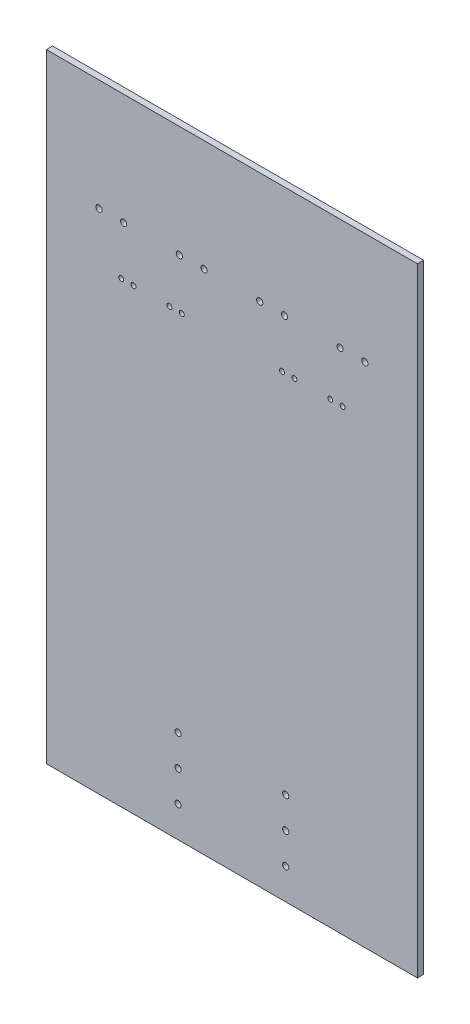
ISO-10303-21;
HEADER;
FILE_DESCRIPTION(('STEP AP214'),'2;1');
FILE_NAME('part.step','',(''),(''),'','','');
FILE_SCHEMA(('AUTOMOTIVE_DESIGN { 1 0 10303 214 1 1 1 1 }'));
ENDSEC;
DATA;
#1=APPLICATION_CONTEXT('core data for automotive mechanical design processes');
#2=APPLICATION_PROTOCOL_DEFINITION('international standard','automotive_design',2000,#1);
#3=PRODUCT_CONTEXT('',#1,'mechanical');
#4=PRODUCT('Part','Part','',(#3));
#5=PRODUCT_RELATED_PRODUCT_CATEGORY('part','',(#4));
#6=PRODUCT_DEFINITION_FORMATION('','',#4);
#7=PRODUCT_DEFINITION_CONTEXT('part definition',#1,'design');
#8=PRODUCT_DEFINITION('design','',#6,#7);
#9=PRODUCT_DEFINITION_SHAPE('','',#8);
#10=(LENGTH_UNIT() NAMED_UNIT(*) SI_UNIT(.MILLI.,.METRE.));
#11=(NAMED_UNIT(*) PLANE_ANGLE_UNIT() SI_UNIT($,.RADIAN.));
#12=(NAMED_UNIT(*) SI_UNIT($,.STERADIAN.) SOLID_ANGLE_UNIT());
#13=UNCERTAINTY_MEASURE_WITH_UNIT(LENGTH_MEASURE(1.E-05),#10,'distance_accuracy_value','');
#14=(GEOMETRIC_REPRESENTATION_CONTEXT(3) GLOBAL_UNCERTAINTY_ASSIGNED_CONTEXT((#13)) GLOBAL_UNIT_ASSIGNED_CONTEXT((#10,
#11,#12)) REPRESENTATION_CONTEXT('',''));
#15=CARTESIAN_POINT('',(0.,0.,0.));
#16=DIRECTION('',(0.,0.,1.));
#17=DIRECTION('',(1.,0.,0.));
#18=AXIS2_PLACEMENT_3D('',#15,#16,#17);
#19=CARTESIAN_POINT('',(0.,0.,5.));
#20=DIRECTION('',(1.,0.,0.));
#21=DIRECTION('',(0.,0.,-1.));
#22=AXIS2_PLACEMENT_3D('',#19,#20,#21);
#23=PLANE('',#22);
#24=DIRECTION('',(0.,-1.,0.));
#25=VECTOR('',#24,1.);
#26=CARTESIAN_POINT('',(0.,0.,0.));
#27=LINE('',#26,#25);
#28=CARTESIAN_POINT('',(0.,500.,0.));
#29=VERTEX_POINT('',#28);
#30=CARTESIAN_POINT('',(0.,0.,0.));
#31=VERTEX_POINT('',#30);
#32=EDGE_CURVE('E101',#29,#31,#27,.T.);
#33=ORIENTED_EDGE('',*,*,#32,.T.);
#34=DIRECTION('',(0.,0.,-1.));
#35=VECTOR('',#34,1.);
#36=CARTESIAN_POINT('',(0.,0.,5.));
#37=LINE('',#36,#35);
#38=CARTESIAN_POINT('',(0.,0.,5.));
#39=VERTEX_POINT('',#38);
#40=EDGE_CURVE('E11',#39,#31,#37,.T.);
#41=ORIENTED_EDGE('',*,*,#40,.F.);
#42=DIRECTION('',(0.,-1.,0.));
#43=VECTOR('',#42,1.);
#44=CARTESIAN_POINT('',(0.,0.,5.));
#45=LINE('',#44,#43);
#46=CARTESIAN_POINT('',(0.,500.,5.));
#47=VERTEX_POINT('',#46);
#48=EDGE_CURVE('E88',#47,#39,#45,.T.);
#49=ORIENTED_EDGE('',*,*,#48,.F.);
#50=DIRECTION('',(0.,0.,-1.));
#51=VECTOR('',#50,1.);
#52=CARTESIAN_POINT('',(0.,500.,5.));
#53=LINE('',#52,#51);
#54=EDGE_CURVE('E97',#47,#29,#53,.T.);
#55=ORIENTED_EDGE('',*,*,#54,.T.);
#56=EDGE_LOOP('',(#33,#41,#49,#55));
#57=FACE_BOUND('',#56,.T.);
#58=ADVANCED_FACE('F35',(#57),#23,.F.);
#59=CARTESIAN_POINT('',(0.,0.,5.));
#60=DIRECTION('',(0.,1.,0.));
#61=DIRECTION('',(0.,0.,1.));
#62=AXIS2_PLACEMENT_3D('',#59,#60,#61);
#63=PLANE('',#62);
#64=DIRECTION('',(1.,0.,0.));
#65=VECTOR('',#64,1.);
#66=CARTESIAN_POINT('',(0.,0.,0.));
#67=LINE('',#66,#65);
#68=CARTESIAN_POINT('',(300.,0.,0.));
#69=VERTEX_POINT('',#68);
#70=EDGE_CURVE('E92',#31,#69,#67,.T.);
#71=ORIENTED_EDGE('',*,*,#70,.T.);
#72=DIRECTION('',(0.,0.,-1.));
#73=VECTOR('',#72,1.);
#74=CARTESIAN_POINT('',(300.,0.,5.));
#75=LINE('',#74,#73);
#76=CARTESIAN_POINT('',(300.,0.,5.));
#77=VERTEX_POINT('',#76);
#78=EDGE_CURVE('E44',#77,#69,#75,.T.);
#79=ORIENTED_EDGE('',*,*,#78,.F.);
#80=DIRECTION('',(1.,0.,0.));
#81=VECTOR('',#80,1.);
#82=CARTESIAN_POINT('',(0.,0.,5.));
#83=LINE('',#82,#81);
#84=EDGE_CURVE('E83',#39,#77,#83,.T.);
#85=ORIENTED_EDGE('',*,*,#84,.F.);
#86=ORIENTED_EDGE('',*,*,#40,.T.);
#87=EDGE_LOOP('',(#71,#79,#85,#86));
#88=FACE_BOUND('',#87,.T.);
#89=ADVANCED_FACE('F91',(#88),#63,.F.);
#90=CARTESIAN_POINT('',(300.,0.,5.));
#91=DIRECTION('',(-1.,0.,0.));
#92=DIRECTION('',(0.,0.,1.));
#93=AXIS2_PLACEMENT_3D('',#90,#91,#92);
#94=PLANE('',#93);
#95=DIRECTION('',(0.,1.,0.));
#96=VECTOR('',#95,1.);
#97=CARTESIAN_POINT('',(300.,0.,0.));
#98=LINE('',#97,#96);
#99=CARTESIAN_POINT('',(300.,500.,0.));
#100=VERTEX_POINT('',#99);
#101=EDGE_CURVE('E70',#69,#100,#98,.T.);
#102=ORIENTED_EDGE('',*,*,#101,.T.);
#103=DIRECTION('',(0.,0.,-1.));
#104=VECTOR('',#103,1.);
#105=CARTESIAN_POINT('',(300.,500.,5.));
#106=LINE('',#105,#104);
#107=CARTESIAN_POINT('',(300.,500.,5.));
#108=VERTEX_POINT('',#107);
#109=EDGE_CURVE('E93',#108,#100,#106,.T.);
#110=ORIENTED_EDGE('',*,*,#109,.F.);
#111=DIRECTION('',(0.,1.,0.));
#112=VECTOR('',#111,1.);
#113=CARTESIAN_POINT('',(300.,0.,5.));
#114=LINE('',#113,#112);
#115=EDGE_CURVE('E86',#77,#108,#114,.T.);
#116=ORIENTED_EDGE('',*,*,#115,.F.);
#117=ORIENTED_EDGE('',*,*,#78,.T.);
#118=EDGE_LOOP('',(#102,#110,#116,#117));
#119=FACE_BOUND('',#118,.T.);
#120=ADVANCED_FACE('F95',(#119),#94,.F.);
#121=CARTESIAN_POINT('',(0.,500.,5.));
#122=DIRECTION('',(0.,-1.,0.));
#123=DIRECTION('',(0.,0.,-1.));
#124=AXIS2_PLACEMENT_3D('',#121,#122,#123);
#125=PLANE('',#124);
#126=DIRECTION('',(-1.,0.,0.));
#127=VECTOR('',#126,1.);
#128=CARTESIAN_POINT('',(0.,500.,0.));
#129=LINE('',#128,#127);
#130=EDGE_CURVE('E76',#100,#29,#129,.T.);
#131=ORIENTED_EDGE('',*,*,#130,.T.);
#132=ORIENTED_EDGE('',*,*,#54,.F.);
#133=DIRECTION('',(-1.,0.,0.));
#134=VECTOR('',#133,1.);
#135=CARTESIAN_POINT('',(0.,500.,5.));
#136=LINE('',#135,#134);
#137=EDGE_CURVE('E53',#108,#47,#136,.T.);
#138=ORIENTED_EDGE('',*,*,#137,.F.);
#139=ORIENTED_EDGE('',*,*,#109,.T.);
#140=EDGE_LOOP('',(#131,#132,#138,#139));
#141=FACE_BOUND('',#140,.T.);
#142=ADVANCED_FACE('F230',(#141),#125,.F.);
#143=CARTESIAN_POINT('',(0.,0.,5.));
#144=DIRECTION('',(0.,0.,-1.));
#145=DIRECTION('',(-1.,0.,0.));
#146=AXIS2_PLACEMENT_3D('',#143,#144,#145);
#147=PLANE('',#146);
#148=CARTESIAN_POINT('',(106.5,50.,5.));
#149=DIRECTION('',(0.,0.,1.));
#150=DIRECTION('',(1.,0.,0.));
#151=AXIS2_PLACEMENT_3D('',#148,#149,#150);
#152=CIRCLE('',#151,2.50000000000001);
#153=CARTESIAN_POINT('',(109.,50.,5.));
#154=VERTEX_POINT('',#153);
#155=EDGE_CURVE('E383',#154,#154,#152,.T.);
#156=ORIENTED_EDGE('',*,*,#155,.F.);
#157=EDGE_LOOP('',(#156));
#158=FACE_BOUND('',#157,.T.);
#159=CARTESIAN_POINT('',(106.5,75.,5.));
#160=DIRECTION('',(0.,0.,1.));
#161=DIRECTION('',(1.,0.,0.));
#162=AXIS2_PLACEMENT_3D('',#159,#160,#161);
#163=CIRCLE('',#162,2.50000000000001);
#164=CARTESIAN_POINT('',(109.,75.,5.));
#165=VERTEX_POINT('',#164);
#166=EDGE_CURVE('E386',#165,#165,#163,.T.);
#167=ORIENTED_EDGE('',*,*,#166,.F.);
#168=EDGE_LOOP('',(#167));
#169=FACE_BOUND('',#168,.T.);
#170=CARTESIAN_POINT('',(193.5,25.,5.));
#171=DIRECTION('',(0.,0.,1.));
#172=DIRECTION('',(1.,0.,0.));
#173=AXIS2_PLACEMENT_3D('',#170,#171,#172);
#174=CIRCLE('',#173,2.5);
#175=CARTESIAN_POINT('',(196.,25.,5.));
#176=VERTEX_POINT('',#175);
#177=EDGE_CURVE('E380',#176,#176,#174,.T.);
#178=ORIENTED_EDGE('',*,*,#177,.F.);
#179=EDGE_LOOP('',(#178));
#180=FACE_BOUND('',#179,.T.);
#181=CARTESIAN_POINT('',(193.5,50.,5.));
#182=DIRECTION('',(0.,0.,1.));
#183=DIRECTION('',(1.,0.,0.));
#184=AXIS2_PLACEMENT_3D('',#181,#182,#183);
#185=CIRCLE('',#184,2.5);
#186=CARTESIAN_POINT('',(196.,50.,5.));
#187=VERTEX_POINT('',#186);
#188=EDGE_CURVE('E377',#187,#187,#185,.T.);
#189=ORIENTED_EDGE('',*,*,#188,.F.);
#190=EDGE_LOOP('',(#189));
#191=FACE_BOUND('',#190,.T.);
#192=CARTESIAN_POINT('',(193.5,75.,5.));
#193=DIRECTION('',(0.,0.,1.));
#194=DIRECTION('',(1.,0.,0.));
#195=AXIS2_PLACEMENT_3D('',#192,#193,#194);
#196=CIRCLE('',#195,2.5);
#197=CARTESIAN_POINT('',(196.,75.,5.));
#198=VERTEX_POINT('',#197);
#199=EDGE_CURVE('E375',#198,#198,#196,.T.);
#200=ORIENTED_EDGE('',*,*,#199,.F.);
#201=EDGE_LOOP('',(#200));
#202=FACE_BOUND('',#201,.T.);
#203=CARTESIAN_POINT('',(106.5,25.,5.));
#204=DIRECTION('',(0.,0.,1.));
#205=DIRECTION('',(1.,0.,0.));
#206=AXIS2_PLACEMENT_3D('',#203,#204,#205);
#207=CIRCLE('',#206,2.50000000000001);
#208=CARTESIAN_POINT('',(109.,25.,5.));
#209=VERTEX_POINT('',#208);
#210=EDGE_CURVE('E162',#209,#209,#207,.T.);
#211=ORIENTED_EDGE('',*,*,#210,.F.);
#212=EDGE_LOOP('',(#211));
#213=FACE_BOUND('',#212,.T.);
#214=CARTESIAN_POINT('',(42.5,410.,5.));
#215=DIRECTION('',(0.,0.,1.));
#216=DIRECTION('',(1.,0.,0.));
#217=AXIS2_PLACEMENT_3D('',#214,#215,#216);
#218=CIRCLE('',#217,2.5);
#219=CARTESIAN_POINT('',(45.,410.,5.));
#220=VERTEX_POINT('',#219);
#221=EDGE_CURVE('E114',#220,#220,#218,.T.);
#222=ORIENTED_EDGE('',*,*,#221,.F.);
#223=EDGE_LOOP('',(#222));
#224=FACE_BOUND('',#223,.T.);
#225=CARTESIAN_POINT('',(60.5,370.,5.));
#226=DIRECTION('',(0.,0.,1.));
#227=DIRECTION('',(1.,0.,0.));
#228=AXIS2_PLACEMENT_3D('',#225,#226,#227);
#229=CIRCLE('',#228,2.);
#230=CARTESIAN_POINT('',(62.5,370.,5.));
#231=VERTEX_POINT('',#230);
#232=EDGE_CURVE('E192',#231,#231,#229,.T.);
#233=ORIENTED_EDGE('',*,*,#232,.F.);
#234=EDGE_LOOP('',(#233));
#235=FACE_BOUND('',#234,.T.);
#236=CARTESIAN_POINT('',(229.5,370.,5.));
#237=DIRECTION('',(0.,0.,1.));
#238=DIRECTION('',(1.,0.,0.));
#239=AXIS2_PLACEMENT_3D('',#236,#237,#238);
#240=CIRCLE('',#239,2.);
#241=CARTESIAN_POINT('',(231.5,370.,5.));
#242=VERTEX_POINT('',#241);
#243=EDGE_CURVE('E188',#242,#242,#240,.T.);
#244=ORIENTED_EDGE('',*,*,#243,.F.);
#245=EDGE_LOOP('',(#244));
#246=FACE_BOUND('',#245,.T.);
#247=CARTESIAN_POINT('',(200.5,370.,5.));
#248=DIRECTION('',(0.,0.,1.));
#249=DIRECTION('',(1.,0.,0.));
#250=AXIS2_PLACEMENT_3D('',#247,#248,#249);
#251=CIRCLE('',#250,2.);
#252=CARTESIAN_POINT('',(202.5,370.,5.));
#253=VERTEX_POINT('',#252);
#254=EDGE_CURVE('E191',#253,#253,#251,.T.);
#255=ORIENTED_EDGE('',*,*,#254,.F.);
#256=EDGE_LOOP('',(#255));
#257=FACE_BOUND('',#256,.T.);
#258=CARTESIAN_POINT('',(257.5,410.,5.));
#259=DIRECTION('',(0.,0.,1.));
#260=DIRECTION('',(1.,0.,0.));
#261=AXIS2_PLACEMENT_3D('',#258,#259,#260);
#262=CIRCLE('',#261,2.50000000000002);
#263=CARTESIAN_POINT('',(260.,410.,5.));
#264=VERTEX_POINT('',#263);
#265=EDGE_CURVE('E195',#264,#264,#262,.T.);
#266=ORIENTED_EDGE('',*,*,#265,.F.);
#267=EDGE_LOOP('',(#266));
#268=FACE_BOUND('',#267,.T.);
#269=CARTESIAN_POINT('',(109.5,370.,5.));
#270=DIRECTION('',(0.,0.,1.));
#271=DIRECTION('',(1.,0.,0.));
#272=AXIS2_PLACEMENT_3D('',#269,#270,#271);
#273=CIRCLE('',#272,2.);
#274=CARTESIAN_POINT('',(111.5,370.,5.));
#275=VERTEX_POINT('',#274);
#276=EDGE_CURVE('E184',#275,#275,#273,.T.);
#277=ORIENTED_EDGE('',*,*,#276,.F.);
#278=EDGE_LOOP('',(#277));
#279=FACE_BOUND('',#278,.T.);
#280=CARTESIAN_POINT('',(190.5,370.,5.));
#281=DIRECTION('',(0.,0.,1.));
#282=DIRECTION('',(1.,0.,0.));
#283=AXIS2_PLACEMENT_3D('',#280,#281,#282);
#284=CIRCLE('',#283,2.);
#285=CARTESIAN_POINT('',(192.5,370.,5.));
#286=VERTEX_POINT('',#285);
#287=EDGE_CURVE('E179',#286,#286,#284,.T.);
#288=ORIENTED_EDGE('',*,*,#287,.F.);
#289=EDGE_LOOP('',(#288));
#290=FACE_BOUND('',#289,.T.);
#291=CARTESIAN_POINT('',(239.5,370.,5.));
#292=DIRECTION('',(0.,0.,1.));
#293=DIRECTION('',(1.,0.,0.));
#294=AXIS2_PLACEMENT_3D('',#291,#292,#293);
#295=CIRCLE('',#294,2.);
#296=CARTESIAN_POINT('',(241.5,370.,5.));
#297=VERTEX_POINT('',#296);
#298=EDGE_CURVE('E175',#297,#297,#295,.T.);
#299=ORIENTED_EDGE('',*,*,#298,.F.);
#300=EDGE_LOOP('',(#299));
#301=FACE_BOUND('',#300,.T.);
#302=CARTESIAN_POINT('',(70.5,370.,5.));
#303=DIRECTION('',(0.,0.,1.));
#304=DIRECTION('',(1.,0.,0.));
#305=AXIS2_PLACEMENT_3D('',#302,#303,#304);
#306=CIRCLE('',#305,2.);
#307=CARTESIAN_POINT('',(72.5,370.,5.));
#308=VERTEX_POINT('',#307);
#309=EDGE_CURVE('E204',#308,#308,#306,.T.);
#310=ORIENTED_EDGE('',*,*,#309,.F.);
#311=EDGE_LOOP('',(#310));
#312=FACE_BOUND('',#311,.T.);
#313=CARTESIAN_POINT('',(127.5,410.000000000001,5.));
#314=DIRECTION('',(0.,0.,1.));
#315=DIRECTION('',(1.,0.,0.));
#316=AXIS2_PLACEMENT_3D('',#313,#314,#315);
#317=CIRCLE('',#316,2.5);
#318=CARTESIAN_POINT('',(130.,410.000000000001,5.));
#319=VERTEX_POINT('',#318);
#320=EDGE_CURVE('E213',#319,#319,#317,.T.);
#321=ORIENTED_EDGE('',*,*,#320,.F.);
#322=EDGE_LOOP('',(#321));
#323=FACE_BOUND('',#322,.T.);
#324=CARTESIAN_POINT('',(107.5,410.,5.));
#325=DIRECTION('',(0.,0.,1.));
#326=DIRECTION('',(1.,0.,0.));
#327=AXIS2_PLACEMENT_3D('',#324,#325,#326);
#328=CIRCLE('',#327,2.5);
#329=CARTESIAN_POINT('',(110.,410.,5.));
#330=VERTEX_POINT('',#329);
#331=EDGE_CURVE('E216',#330,#330,#328,.T.);
#332=ORIENTED_EDGE('',*,*,#331,.F.);
#333=EDGE_LOOP('',(#332));
#334=FACE_BOUND('',#333,.T.);
#335=CARTESIAN_POINT('',(62.5,410.,5.));
#336=DIRECTION('',(0.,0.,1.));
#337=DIRECTION('',(1.,0.,0.));
#338=AXIS2_PLACEMENT_3D('',#335,#336,#337);
#339=CIRCLE('',#338,2.50000000000001);
#340=CARTESIAN_POINT('',(65.,410.,5.));
#341=VERTEX_POINT('',#340);
#342=EDGE_CURVE('E219',#341,#341,#339,.T.);
#343=ORIENTED_EDGE('',*,*,#342,.F.);
#344=EDGE_LOOP('',(#343));
#345=FACE_BOUND('',#344,.T.);
#346=CARTESIAN_POINT('',(99.5,370.,5.));
#347=DIRECTION('',(0.,0.,1.));
#348=DIRECTION('',(1.,0.,0.));
#349=AXIS2_PLACEMENT_3D('',#346,#347,#348);
#350=CIRCLE('',#349,2.);
#351=CARTESIAN_POINT('',(101.5,370.,5.));
#352=VERTEX_POINT('',#351);
#353=EDGE_CURVE('E201',#352,#352,#350,.T.);
#354=ORIENTED_EDGE('',*,*,#353,.F.);
#355=EDGE_LOOP('',(#354));
#356=FACE_BOUND('',#355,.T.);
#357=CARTESIAN_POINT('',(172.5,410.,5.));
#358=DIRECTION('',(0.,0.,1.));
#359=DIRECTION('',(1.,0.,0.));
#360=AXIS2_PLACEMENT_3D('',#357,#358,#359);
#361=CIRCLE('',#360,2.5);
#362=CARTESIAN_POINT('',(175.,410.,5.));
#363=VERTEX_POINT('',#362);
#364=EDGE_CURVE('E205',#363,#363,#361,.T.);
#365=ORIENTED_EDGE('',*,*,#364,.F.);
#366=EDGE_LOOP('',(#365));
#367=FACE_BOUND('',#366,.T.);
#368=CARTESIAN_POINT('',(192.5,410.,5.));
#369=DIRECTION('',(0.,0.,1.));
#370=DIRECTION('',(1.,0.,0.));
#371=AXIS2_PLACEMENT_3D('',#368,#369,#370);
#372=CIRCLE('',#371,2.5);
#373=CARTESIAN_POINT('',(195.,410.,5.));
#374=VERTEX_POINT('',#373);
#375=EDGE_CURVE('E208',#374,#374,#372,.T.);
#376=ORIENTED_EDGE('',*,*,#375,.F.);
#377=EDGE_LOOP('',(#376));
#378=FACE_BOUND('',#377,.T.);
#379=CARTESIAN_POINT('',(237.5,410.,5.));
#380=DIRECTION('',(0.,0.,1.));
#381=DIRECTION('',(1.,0.,0.));
#382=AXIS2_PLACEMENT_3D('',#379,#380,#381);
#383=CIRCLE('',#382,2.50000000000002);
#384=CARTESIAN_POINT('',(240.,410.,5.));
#385=VERTEX_POINT('',#384);
#386=EDGE_CURVE('E198',#385,#385,#383,.T.);
#387=ORIENTED_EDGE('',*,*,#386,.F.);
#388=EDGE_LOOP('',(#387));
#389=FACE_BOUND('',#388,.T.);
#390=ORIENTED_EDGE('',*,*,#48,.T.);
#391=ORIENTED_EDGE('',*,*,#84,.T.);
#392=ORIENTED_EDGE('',*,*,#115,.T.);
#393=ORIENTED_EDGE('',*,*,#137,.T.);
#394=EDGE_LOOP('',(#390,#391,#392,#393));
#395=FACE_BOUND('',#394,.T.);
#396=ADVANCED_FACE('F84',(#158,#169,#180,#191,#202,#213,#224,#235,#246,#257,#268,#279,#290,#301,
#312,#323,#334,#345,#356,#367,#378,#389,#395),#147,.F.);
#397=CARTESIAN_POINT('',(0.,0.,0.));
#398=DIRECTION('',(0.,0.,-1.));
#399=DIRECTION('',(-1.,0.,0.));
#400=AXIS2_PLACEMENT_3D('',#397,#398,#399);
#401=PLANE('',#400);
#402=CARTESIAN_POINT('',(106.5,50.,0.));
#403=DIRECTION('',(0.,0.,-1.));
#404=DIRECTION('',(-1.,0.,0.));
#405=AXIS2_PLACEMENT_3D('',#402,#403,#404);
#406=CIRCLE('',#405,2.50000000000001);
#407=CARTESIAN_POINT('',(104.,50.,0.));
#408=VERTEX_POINT('',#407);
#409=EDGE_CURVE('E38',#408,#408,#406,.T.);
#410=ORIENTED_EDGE('',*,*,#409,.F.);
#411=EDGE_LOOP('',(#410));
#412=FACE_BOUND('',#411,.T.);
#413=CARTESIAN_POINT('',(106.5,75.,0.));
#414=DIRECTION('',(0.,0.,-1.));
#415=DIRECTION('',(-1.,0.,0.));
#416=AXIS2_PLACEMENT_3D('',#413,#414,#415);
#417=CIRCLE('',#416,2.50000000000001);
#418=CARTESIAN_POINT('',(104.,75.,0.));
#419=VERTEX_POINT('',#418);
#420=EDGE_CURVE('E170',#419,#419,#417,.T.);
#421=ORIENTED_EDGE('',*,*,#420,.F.);
#422=EDGE_LOOP('',(#421));
#423=FACE_BOUND('',#422,.T.);
#424=CARTESIAN_POINT('',(193.5,25.,0.));
#425=DIRECTION('',(0.,0.,-1.));
#426=DIRECTION('',(-1.,0.,0.));
#427=AXIS2_PLACEMENT_3D('',#424,#425,#426);
#428=CIRCLE('',#427,2.5);
#429=CARTESIAN_POINT('',(191.,25.,0.));
#430=VERTEX_POINT('',#429);
#431=EDGE_CURVE('E168',#430,#430,#428,.T.);
#432=ORIENTED_EDGE('',*,*,#431,.F.);
#433=EDGE_LOOP('',(#432));
#434=FACE_BOUND('',#433,.T.);
#435=CARTESIAN_POINT('',(193.5,50.,0.));
#436=DIRECTION('',(0.,0.,-1.));
#437=DIRECTION('',(-1.,0.,0.));
#438=AXIS2_PLACEMENT_3D('',#435,#436,#437);
#439=CIRCLE('',#438,2.5);
#440=CARTESIAN_POINT('',(191.,50.,0.));
#441=VERTEX_POINT('',#440);
#442=EDGE_CURVE('E165',#441,#441,#439,.T.);
#443=ORIENTED_EDGE('',*,*,#442,.F.);
#444=EDGE_LOOP('',(#443));
#445=FACE_BOUND('',#444,.T.);
#446=CARTESIAN_POINT('',(193.5,75.,0.));
#447=DIRECTION('',(0.,0.,-1.));
#448=DIRECTION('',(-1.,0.,0.));
#449=AXIS2_PLACEMENT_3D('',#446,#447,#448);
#450=CIRCLE('',#449,2.5);
#451=CARTESIAN_POINT('',(191.,75.,0.));
#452=VERTEX_POINT('',#451);
#453=EDGE_CURVE('E161',#452,#452,#450,.T.);
#454=ORIENTED_EDGE('',*,*,#453,.F.);
#455=EDGE_LOOP('',(#454));
#456=FACE_BOUND('',#455,.T.);
#457=CARTESIAN_POINT('',(106.5,25.,0.));
#458=DIRECTION('',(0.,0.,-1.));
#459=DIRECTION('',(-1.,0.,0.));
#460=AXIS2_PLACEMENT_3D('',#457,#458,#459);
#461=CIRCLE('',#460,2.50000000000001);
#462=CARTESIAN_POINT('',(104.,25.,0.));
#463=VERTEX_POINT('',#462);
#464=EDGE_CURVE('E158',#463,#463,#461,.T.);
#465=ORIENTED_EDGE('',*,*,#464,.F.);
#466=EDGE_LOOP('',(#465));
#467=FACE_BOUND('',#466,.T.);
#468=CARTESIAN_POINT('',(42.5,410.,0.));
#469=DIRECTION('',(0.,0.,-1.));
#470=DIRECTION('',(-1.,0.,0.));
#471=AXIS2_PLACEMENT_3D('',#468,#469,#470);
#472=CIRCLE('',#471,2.5);
#473=CARTESIAN_POINT('',(40.,410.,0.));
#474=VERTEX_POINT('',#473);
#475=EDGE_CURVE('E104',#474,#474,#472,.T.);
#476=ORIENTED_EDGE('',*,*,#475,.F.);
#477=EDGE_LOOP('',(#476));
#478=FACE_BOUND('',#477,.T.);
#479=CARTESIAN_POINT('',(60.5,370.,0.));
#480=DIRECTION('',(0.,0.,-1.));
#481=DIRECTION('',(-1.,0.,0.));
#482=AXIS2_PLACEMENT_3D('',#479,#480,#481);
#483=CIRCLE('',#482,2.);
#484=CARTESIAN_POINT('',(58.5,370.,0.));
#485=VERTEX_POINT('',#484);
#486=EDGE_CURVE('E153',#485,#485,#483,.T.);
#487=ORIENTED_EDGE('',*,*,#486,.F.);
#488=EDGE_LOOP('',(#487));
#489=FACE_BOUND('',#488,.T.);
#490=CARTESIAN_POINT('',(229.5,370.,0.));
#491=DIRECTION('',(0.,0.,-1.));
#492=DIRECTION('',(-1.,0.,0.));
#493=AXIS2_PLACEMENT_3D('',#490,#491,#492);
#494=CIRCLE('',#493,2.);
#495=CARTESIAN_POINT('',(227.5,370.,0.));
#496=VERTEX_POINT('',#495);
#497=EDGE_CURVE('E150',#496,#496,#494,.T.);
#498=ORIENTED_EDGE('',*,*,#497,.F.);
#499=EDGE_LOOP('',(#498));
#500=FACE_BOUND('',#499,.T.);
#501=CARTESIAN_POINT('',(200.5,370.,0.));
#502=DIRECTION('',(0.,0.,-1.));
#503=DIRECTION('',(-1.,0.,0.));
#504=AXIS2_PLACEMENT_3D('',#501,#502,#503);
#505=CIRCLE('',#504,2.);
#506=CARTESIAN_POINT('',(198.5,370.,0.));
#507=VERTEX_POINT('',#506);
#508=EDGE_CURVE('E147',#507,#507,#505,.T.);
#509=ORIENTED_EDGE('',*,*,#508,.F.);
#510=EDGE_LOOP('',(#509));
#511=FACE_BOUND('',#510,.T.);
#512=CARTESIAN_POINT('',(257.5,410.,0.));
#513=DIRECTION('',(0.,0.,-1.));
#514=DIRECTION('',(-1.,0.,0.));
#515=AXIS2_PLACEMENT_3D('',#512,#513,#514);
#516=CIRCLE('',#515,2.50000000000002);
#517=CARTESIAN_POINT('',(255.,410.,0.));
#518=VERTEX_POINT('',#517);
#519=EDGE_CURVE('E144',#518,#518,#516,.T.);
#520=ORIENTED_EDGE('',*,*,#519,.F.);
#521=EDGE_LOOP('',(#520));
#522=FACE_BOUND('',#521,.T.);
#523=CARTESIAN_POINT('',(109.5,370.,0.));
#524=DIRECTION('',(0.,0.,-1.));
#525=DIRECTION('',(-1.,0.,0.));
#526=AXIS2_PLACEMENT_3D('',#523,#524,#525);
#527=CIRCLE('',#526,2.);
#528=CARTESIAN_POINT('',(107.5,370.,0.));
#529=VERTEX_POINT('',#528);
#530=EDGE_CURVE('E141',#529,#529,#527,.T.);
#531=ORIENTED_EDGE('',*,*,#530,.F.);
#532=EDGE_LOOP('',(#531));
#533=FACE_BOUND('',#532,.T.);
#534=CARTESIAN_POINT('',(190.5,370.,0.));
#535=DIRECTION('',(0.,0.,-1.));
#536=DIRECTION('',(-1.,0.,0.));
#537=AXIS2_PLACEMENT_3D('',#534,#535,#536);
#538=CIRCLE('',#537,2.);
#539=CARTESIAN_POINT('',(188.5,370.,0.));
#540=VERTEX_POINT('',#539);
#541=EDGE_CURVE('E138',#540,#540,#538,.T.);
#542=ORIENTED_EDGE('',*,*,#541,.F.);
#543=EDGE_LOOP('',(#542));
#544=FACE_BOUND('',#543,.T.);
#545=CARTESIAN_POINT('',(239.5,370.,0.));
#546=DIRECTION('',(0.,0.,-1.));
#547=DIRECTION('',(-1.,0.,0.));
#548=AXIS2_PLACEMENT_3D('',#545,#546,#547);
#549=CIRCLE('',#548,2.);
#550=CARTESIAN_POINT('',(237.5,370.,0.));
#551=VERTEX_POINT('',#550);
#552=EDGE_CURVE('E135',#551,#551,#549,.T.);
#553=ORIENTED_EDGE('',*,*,#552,.F.);
#554=EDGE_LOOP('',(#553));
#555=FACE_BOUND('',#554,.T.);
#556=CARTESIAN_POINT('',(70.5,370.,0.));
#557=DIRECTION('',(0.,0.,-1.));
#558=DIRECTION('',(-1.,0.,0.));
#559=AXIS2_PLACEMENT_3D('',#556,#557,#558);
#560=CIRCLE('',#559,2.);
#561=CARTESIAN_POINT('',(68.5,370.,0.));
#562=VERTEX_POINT('',#561);
#563=EDGE_CURVE('E132',#562,#562,#560,.T.);
#564=ORIENTED_EDGE('',*,*,#563,.F.);
#565=EDGE_LOOP('',(#564));
#566=FACE_BOUND('',#565,.T.);
#567=CARTESIAN_POINT('',(127.5,410.000000000001,0.));
#568=DIRECTION('',(0.,0.,-1.));
#569=DIRECTION('',(-1.,0.,0.));
#570=AXIS2_PLACEMENT_3D('',#567,#568,#569);
#571=CIRCLE('',#570,2.5);
#572=CARTESIAN_POINT('',(125.,410.000000000001,0.));
#573=VERTEX_POINT('',#572);
#574=EDGE_CURVE('E129',#573,#573,#571,.T.);
#575=ORIENTED_EDGE('',*,*,#574,.F.);
#576=EDGE_LOOP('',(#575));
#577=FACE_BOUND('',#576,.T.);
#578=CARTESIAN_POINT('',(107.5,410.,0.));
#579=DIRECTION('',(0.,0.,-1.));
#580=DIRECTION('',(-1.,0.,0.));
#581=AXIS2_PLACEMENT_3D('',#578,#579,#580);
#582=CIRCLE('',#581,2.5);
#583=CARTESIAN_POINT('',(105.,410.,0.));
#584=VERTEX_POINT('',#583);
#585=EDGE_CURVE('E126',#584,#584,#582,.T.);
#586=ORIENTED_EDGE('',*,*,#585,.F.);
#587=EDGE_LOOP('',(#586));
#588=FACE_BOUND('',#587,.T.);
#589=CARTESIAN_POINT('',(62.5,410.,0.));
#590=DIRECTION('',(0.,0.,-1.));
#591=DIRECTION('',(-1.,0.,0.));
#592=AXIS2_PLACEMENT_3D('',#589,#590,#591);
#593=CIRCLE('',#592,2.50000000000001);
#594=CARTESIAN_POINT('',(60.,410.,0.));
#595=VERTEX_POINT('',#594);
#596=EDGE_CURVE('E123',#595,#595,#593,.T.);
#597=ORIENTED_EDGE('',*,*,#596,.F.);
#598=EDGE_LOOP('',(#597));
#599=FACE_BOUND('',#598,.T.);
#600=CARTESIAN_POINT('',(99.5,370.,0.));
#601=DIRECTION('',(0.,0.,-1.));
#602=DIRECTION('',(-1.,0.,0.));
#603=AXIS2_PLACEMENT_3D('',#600,#601,#602);
#604=CIRCLE('',#603,2.);
#605=CARTESIAN_POINT('',(97.5,370.,0.));
#606=VERTEX_POINT('',#605);
#607=EDGE_CURVE('E120',#606,#606,#604,.T.);
#608=ORIENTED_EDGE('',*,*,#607,.F.);
#609=EDGE_LOOP('',(#608));
#610=FACE_BOUND('',#609,.T.);
#611=CARTESIAN_POINT('',(172.5,410.,0.));
#612=DIRECTION('',(0.,0.,-1.));
#613=DIRECTION('',(-1.,0.,0.));
#614=AXIS2_PLACEMENT_3D('',#611,#612,#613);
#615=CIRCLE('',#614,2.5);
#616=CARTESIAN_POINT('',(170.,410.,0.));
#617=VERTEX_POINT('',#616);
#618=EDGE_CURVE('E117',#617,#617,#615,.T.);
#619=ORIENTED_EDGE('',*,*,#618,.F.);
#620=EDGE_LOOP('',(#619));
#621=FACE_BOUND('',#620,.T.);
#622=CARTESIAN_POINT('',(192.5,410.,0.));
#623=DIRECTION('',(0.,0.,-1.));
#624=DIRECTION('',(-1.,0.,0.));
#625=AXIS2_PLACEMENT_3D('',#622,#623,#624);
#626=CIRCLE('',#625,2.5);
#627=CARTESIAN_POINT('',(190.,410.,0.));
#628=VERTEX_POINT('',#627);
#629=EDGE_CURVE('E113',#628,#628,#626,.T.);
#630=ORIENTED_EDGE('',*,*,#629,.F.);
#631=EDGE_LOOP('',(#630));
#632=FACE_BOUND('',#631,.T.);
#633=CARTESIAN_POINT('',(237.5,410.,0.));
#634=DIRECTION('',(0.,0.,-1.));
#635=DIRECTION('',(-1.,0.,0.));
#636=AXIS2_PLACEMENT_3D('',#633,#634,#635);
#637=CIRCLE('',#636,2.50000000000002);
#638=CARTESIAN_POINT('',(235.,410.,0.));
#639=VERTEX_POINT('',#638);
#640=EDGE_CURVE('E110',#639,#639,#637,.T.);
#641=ORIENTED_EDGE('',*,*,#640,.F.);
#642=EDGE_LOOP('',(#641));
#643=FACE_BOUND('',#642,.T.);
#644=ORIENTED_EDGE('',*,*,#32,.F.);
#645=ORIENTED_EDGE('',*,*,#130,.F.);
#646=ORIENTED_EDGE('',*,*,#101,.F.);
#647=ORIENTED_EDGE('',*,*,#70,.F.);
#648=EDGE_LOOP('',(#644,#645,#646,#647));
#649=FACE_BOUND('',#648,.T.);
#650=ADVANCED_FACE('F229',(#412,#423,#434,#445,#456,#467,#478,#489,#500,#511,#522,#533,#544,
#555,#566,#577,#588,#599,#610,#621,#632,#643,#649),#401,.T.);
#651=CARTESIAN_POINT('',(237.5,410.,-5.));
#652=DIRECTION('',(0.,0.,1.));
#653=DIRECTION('',(1.,0.,0.));
#654=AXIS2_PLACEMENT_3D('',#651,#652,#653);
#655=CYLINDRICAL_SURFACE('',#654,2.50000000000002);
#656=ORIENTED_EDGE('',*,*,#640,.T.);
#657=EDGE_LOOP('',(#656));
#658=FACE_BOUND('',#657,.T.);
#659=ORIENTED_EDGE('',*,*,#386,.T.);
#660=EDGE_LOOP('',(#659));
#661=FACE_BOUND('',#660,.T.);
#662=ADVANCED_FACE('F243',(#658,#661),#655,.F.);
#663=CARTESIAN_POINT('',(192.5,410.,-5.));
#664=DIRECTION('',(0.,0.,1.));
#665=DIRECTION('',(1.,0.,0.));
#666=AXIS2_PLACEMENT_3D('',#663,#664,#665);
#667=CYLINDRICAL_SURFACE('',#666,2.5);
#668=ORIENTED_EDGE('',*,*,#629,.T.);
#669=EDGE_LOOP('',(#668));
#670=FACE_BOUND('',#669,.T.);
#671=ORIENTED_EDGE('',*,*,#375,.T.);
#672=EDGE_LOOP('',(#671));
#673=FACE_BOUND('',#672,.T.);
#674=ADVANCED_FACE('F245',(#670,#673),#667,.F.);
#675=CARTESIAN_POINT('',(172.5,410.,-5.));
#676=DIRECTION('',(0.,0.,1.));
#677=DIRECTION('',(1.,0.,0.));
#678=AXIS2_PLACEMENT_3D('',#675,#676,#677);
#679=CYLINDRICAL_SURFACE('',#678,2.5);
#680=ORIENTED_EDGE('',*,*,#618,.T.);
#681=EDGE_LOOP('',(#680));
#682=FACE_BOUND('',#681,.T.);
#683=ORIENTED_EDGE('',*,*,#364,.T.);
#684=EDGE_LOOP('',(#683));
#685=FACE_BOUND('',#684,.T.);
#686=ADVANCED_FACE('F252',(#682,#685),#679,.F.);
#687=CARTESIAN_POINT('',(99.5,370.,-5.));
#688=DIRECTION('',(0.,0.,1.));
#689=DIRECTION('',(1.,0.,0.));
#690=AXIS2_PLACEMENT_3D('',#687,#688,#689);
#691=CYLINDRICAL_SURFACE('',#690,2.);
#692=ORIENTED_EDGE('',*,*,#607,.T.);
#693=EDGE_LOOP('',(#692));
#694=FACE_BOUND('',#693,.T.);
#695=ORIENTED_EDGE('',*,*,#353,.T.);
#696=EDGE_LOOP('',(#695));
#697=FACE_BOUND('',#696,.T.);
#698=ADVANCED_FACE('F279',(#694,#697),#691,.F.);
#699=CARTESIAN_POINT('',(62.5,410.,-5.));
#700=DIRECTION('',(0.,0.,1.));
#701=DIRECTION('',(1.,0.,0.));
#702=AXIS2_PLACEMENT_3D('',#699,#700,#701);
#703=CYLINDRICAL_SURFACE('',#702,2.50000000000001);
#704=ORIENTED_EDGE('',*,*,#596,.T.);
#705=EDGE_LOOP('',(#704));
#706=FACE_BOUND('',#705,.T.);
#707=ORIENTED_EDGE('',*,*,#342,.T.);
#708=EDGE_LOOP('',(#707));
#709=FACE_BOUND('',#708,.T.);
#710=ADVANCED_FACE('F275',(#706,#709),#703,.F.);
#711=CARTESIAN_POINT('',(107.5,410.,-5.));
#712=DIRECTION('',(0.,0.,1.));
#713=DIRECTION('',(1.,0.,0.));
#714=AXIS2_PLACEMENT_3D('',#711,#712,#713);
#715=CYLINDRICAL_SURFACE('',#714,2.5);
#716=ORIENTED_EDGE('',*,*,#585,.T.);
#717=EDGE_LOOP('',(#716));
#718=FACE_BOUND('',#717,.T.);
#719=ORIENTED_EDGE('',*,*,#331,.T.);
#720=EDGE_LOOP('',(#719));
#721=FACE_BOUND('',#720,.T.);
#722=ADVANCED_FACE('F225',(#718,#721),#715,.F.);
#723=CARTESIAN_POINT('',(127.5,410.000000000001,-5.));
#724=DIRECTION('',(0.,0.,1.));
#725=DIRECTION('',(1.,0.,0.));
#726=AXIS2_PLACEMENT_3D('',#723,#724,#725);
#727=CYLINDRICAL_SURFACE('',#726,2.5);
#728=ORIENTED_EDGE('',*,*,#574,.T.);
#729=EDGE_LOOP('',(#728));
#730=FACE_BOUND('',#729,.T.);
#731=ORIENTED_EDGE('',*,*,#320,.T.);
#732=EDGE_LOOP('',(#731));
#733=FACE_BOUND('',#732,.T.);
#734=ADVANCED_FACE('F274',(#730,#733),#727,.F.);
#735=CARTESIAN_POINT('',(70.5,370.,-5.));
#736=DIRECTION('',(0.,0.,1.));
#737=DIRECTION('',(1.,0.,0.));
#738=AXIS2_PLACEMENT_3D('',#735,#736,#737);
#739=CYLINDRICAL_SURFACE('',#738,2.);
#740=ORIENTED_EDGE('',*,*,#563,.T.);
#741=EDGE_LOOP('',(#740));
#742=FACE_BOUND('',#741,.T.);
#743=ORIENTED_EDGE('',*,*,#309,.T.);
#744=EDGE_LOOP('',(#743));
#745=FACE_BOUND('',#744,.T.);
#746=ADVANCED_FACE('F281',(#742,#745),#739,.F.);
#747=CARTESIAN_POINT('',(239.5,370.,-5.));
#748=DIRECTION('',(0.,0.,1.));
#749=DIRECTION('',(1.,0.,0.));
#750=AXIS2_PLACEMENT_3D('',#747,#748,#749);
#751=CYLINDRICAL_SURFACE('',#750,2.);
#752=ORIENTED_EDGE('',*,*,#552,.T.);
#753=EDGE_LOOP('',(#752));
#754=FACE_BOUND('',#753,.T.);
#755=ORIENTED_EDGE('',*,*,#298,.T.);
#756=EDGE_LOOP('',(#755));
#757=FACE_BOUND('',#756,.T.);
#758=ADVANCED_FACE('F283',(#754,#757),#751,.F.);
#759=CARTESIAN_POINT('',(190.5,370.,-5.));
#760=DIRECTION('',(0.,0.,1.));
#761=DIRECTION('',(1.,0.,0.));
#762=AXIS2_PLACEMENT_3D('',#759,#760,#761);
#763=CYLINDRICAL_SURFACE('',#762,2.);
#764=ORIENTED_EDGE('',*,*,#541,.T.);
#765=EDGE_LOOP('',(#764));
#766=FACE_BOUND('',#765,.T.);
#767=ORIENTED_EDGE('',*,*,#287,.T.);
#768=EDGE_LOOP('',(#767));
#769=FACE_BOUND('',#768,.T.);
#770=ADVANCED_FACE('F337',(#766,#769),#763,.F.);
#771=CARTESIAN_POINT('',(109.5,370.,-5.));
#772=DIRECTION('',(0.,0.,1.));
#773=DIRECTION('',(1.,0.,0.));
#774=AXIS2_PLACEMENT_3D('',#771,#772,#773);
#775=CYLINDRICAL_SURFACE('',#774,2.);
#776=ORIENTED_EDGE('',*,*,#530,.T.);
#777=EDGE_LOOP('',(#776));
#778=FACE_BOUND('',#777,.T.);
#779=ORIENTED_EDGE('',*,*,#276,.T.);
#780=EDGE_LOOP('',(#779));
#781=FACE_BOUND('',#780,.T.);
#782=ADVANCED_FACE('F325',(#778,#781),#775,.F.);
#783=CARTESIAN_POINT('',(257.5,410.,-5.));
#784=DIRECTION('',(0.,0.,1.));
#785=DIRECTION('',(1.,0.,0.));
#786=AXIS2_PLACEMENT_3D('',#783,#784,#785);
#787=CYLINDRICAL_SURFACE('',#786,2.50000000000002);
#788=ORIENTED_EDGE('',*,*,#519,.T.);
#789=EDGE_LOOP('',(#788));
#790=FACE_BOUND('',#789,.T.);
#791=ORIENTED_EDGE('',*,*,#265,.T.);
#792=EDGE_LOOP('',(#791));
#793=FACE_BOUND('',#792,.T.);
#794=ADVANCED_FACE('F321',(#790,#793),#787,.F.);
#795=CARTESIAN_POINT('',(200.5,370.,-5.));
#796=DIRECTION('',(0.,0.,1.));
#797=DIRECTION('',(1.,0.,0.));
#798=AXIS2_PLACEMENT_3D('',#795,#796,#797);
#799=CYLINDRICAL_SURFACE('',#798,2.);
#800=ORIENTED_EDGE('',*,*,#508,.T.);
#801=EDGE_LOOP('',(#800));
#802=FACE_BOUND('',#801,.T.);
#803=ORIENTED_EDGE('',*,*,#254,.T.);
#804=EDGE_LOOP('',(#803));
#805=FACE_BOUND('',#804,.T.);
#806=ADVANCED_FACE('F317',(#802,#805),#799,.F.);
#807=CARTESIAN_POINT('',(229.5,370.,-5.));
#808=DIRECTION('',(0.,0.,1.));
#809=DIRECTION('',(1.,0.,0.));
#810=AXIS2_PLACEMENT_3D('',#807,#808,#809);
#811=CYLINDRICAL_SURFACE('',#810,2.);
#812=ORIENTED_EDGE('',*,*,#497,.T.);
#813=EDGE_LOOP('',(#812));
#814=FACE_BOUND('',#813,.T.);
#815=ORIENTED_EDGE('',*,*,#243,.T.);
#816=EDGE_LOOP('',(#815));
#817=FACE_BOUND('',#816,.T.);
#818=ADVANCED_FACE('F320',(#814,#817),#811,.F.);
#819=CARTESIAN_POINT('',(60.5,370.,-5.));
#820=DIRECTION('',(0.,0.,1.));
#821=DIRECTION('',(1.,0.,0.));
#822=AXIS2_PLACEMENT_3D('',#819,#820,#821);
#823=CYLINDRICAL_SURFACE('',#822,2.);
#824=ORIENTED_EDGE('',*,*,#486,.T.);
#825=EDGE_LOOP('',(#824));
#826=FACE_BOUND('',#825,.T.);
#827=ORIENTED_EDGE('',*,*,#232,.T.);
#828=EDGE_LOOP('',(#827));
#829=FACE_BOUND('',#828,.T.);
#830=ADVANCED_FACE('F327',(#826,#829),#823,.F.);
#831=CARTESIAN_POINT('',(42.5,410.,-5.));
#832=DIRECTION('',(0.,0.,1.));
#833=DIRECTION('',(1.,0.,0.));
#834=AXIS2_PLACEMENT_3D('',#831,#832,#833);
#835=CYLINDRICAL_SURFACE('',#834,2.5);
#836=ORIENTED_EDGE('',*,*,#475,.T.);
#837=EDGE_LOOP('',(#836));
#838=FACE_BOUND('',#837,.T.);
#839=ORIENTED_EDGE('',*,*,#221,.T.);
#840=EDGE_LOOP('',(#839));
#841=FACE_BOUND('',#840,.T.);
#842=ADVANCED_FACE('F330',(#838,#841),#835,.F.);
#843=CARTESIAN_POINT('',(106.5,25.,-5.));
#844=DIRECTION('',(0.,0.,1.));
#845=DIRECTION('',(1.,0.,0.));
#846=AXIS2_PLACEMENT_3D('',#843,#844,#845);
#847=CYLINDRICAL_SURFACE('',#846,2.50000000000001);
#848=ORIENTED_EDGE('',*,*,#464,.T.);
#849=EDGE_LOOP('',(#848));
#850=FACE_BOUND('',#849,.T.);
#851=ORIENTED_EDGE('',*,*,#210,.T.);
#852=EDGE_LOOP('',(#851));
#853=FACE_BOUND('',#852,.T.);
#854=ADVANCED_FACE('F347',(#850,#853),#847,.F.);
#855=CARTESIAN_POINT('',(193.5,75.,-5.));
#856=DIRECTION('',(0.,0.,1.));
#857=DIRECTION('',(1.,0.,0.));
#858=AXIS2_PLACEMENT_3D('',#855,#856,#857);
#859=CYLINDRICAL_SURFACE('',#858,2.5);
#860=ORIENTED_EDGE('',*,*,#453,.T.);
#861=EDGE_LOOP('',(#860));
#862=FACE_BOUND('',#861,.T.);
#863=ORIENTED_EDGE('',*,*,#199,.T.);
#864=EDGE_LOOP('',(#863));
#865=FACE_BOUND('',#864,.T.);
#866=ADVANCED_FACE('F351',(#862,#865),#859,.F.);
#867=CARTESIAN_POINT('',(193.5,50.,-5.));
#868=DIRECTION('',(0.,0.,1.));
#869=DIRECTION('',(1.,0.,0.));
#870=AXIS2_PLACEMENT_3D('',#867,#868,#869);
#871=CYLINDRICAL_SURFACE('',#870,2.5);
#872=ORIENTED_EDGE('',*,*,#442,.T.);
#873=EDGE_LOOP('',(#872));
#874=FACE_BOUND('',#873,.T.);
#875=ORIENTED_EDGE('',*,*,#188,.T.);
#876=EDGE_LOOP('',(#875));
#877=FACE_BOUND('',#876,.T.);
#878=ADVANCED_FACE('F353',(#874,#877),#871,.F.);
#879=CARTESIAN_POINT('',(193.5,25.,-5.));
#880=DIRECTION('',(0.,0.,1.));
#881=DIRECTION('',(1.,0.,0.));
#882=AXIS2_PLACEMENT_3D('',#879,#880,#881);
#883=CYLINDRICAL_SURFACE('',#882,2.5);
#884=ORIENTED_EDGE('',*,*,#431,.T.);
#885=EDGE_LOOP('',(#884));
#886=FACE_BOUND('',#885,.T.);
#887=ORIENTED_EDGE('',*,*,#177,.T.);
#888=EDGE_LOOP('',(#887));
#889=FACE_BOUND('',#888,.T.);
#890=ADVANCED_FACE('F356',(#886,#889),#883,.F.);
#891=CARTESIAN_POINT('',(106.5,75.,-5.));
#892=DIRECTION('',(0.,0.,1.));
#893=DIRECTION('',(1.,0.,0.));
#894=AXIS2_PLACEMENT_3D('',#891,#892,#893);
#895=CYLINDRICAL_SURFACE('',#894,2.50000000000001);
#896=ORIENTED_EDGE('',*,*,#420,.T.);
#897=EDGE_LOOP('',(#896));
#898=FACE_BOUND('',#897,.T.);
#899=ORIENTED_EDGE('',*,*,#166,.T.);
#900=EDGE_LOOP('',(#899));
#901=FACE_BOUND('',#900,.T.);
#902=ADVANCED_FACE('F360',(#898,#901),#895,.F.);
#903=CARTESIAN_POINT('',(106.5,50.,-5.));
#904=DIRECTION('',(0.,0.,1.));
#905=DIRECTION('',(1.,0.,0.));
#906=AXIS2_PLACEMENT_3D('',#903,#904,#905);
#907=CYLINDRICAL_SURFACE('',#906,2.50000000000001);
#908=ORIENTED_EDGE('',*,*,#409,.T.);
#909=EDGE_LOOP('',(#908));
#910=FACE_BOUND('',#909,.T.);
#911=ORIENTED_EDGE('',*,*,#155,.T.);
#912=EDGE_LOOP('',(#911));
#913=FACE_BOUND('',#912,.T.);
#914=ADVANCED_FACE('F364',(#910,#913),#907,.F.);
#915=CLOSED_SHELL('',(#58,#89,#120,#142,#396,#650,#662,#674,#686,#698,#710,#722,#734,#746,#758,
#770,#782,#794,#806,#818,#830,#842,#854,#866,#878,#890,#902,#914));
#916=MANIFOLD_SOLID_BREP('B2',#915);
#917=ADVANCED_BREP_SHAPE_REPRESENTATION('',(#18,#916),#14);
#918=SHAPE_DEFINITION_REPRESENTATION(#9,#917);
ENDSEC;
END-ISO-10303-21;
